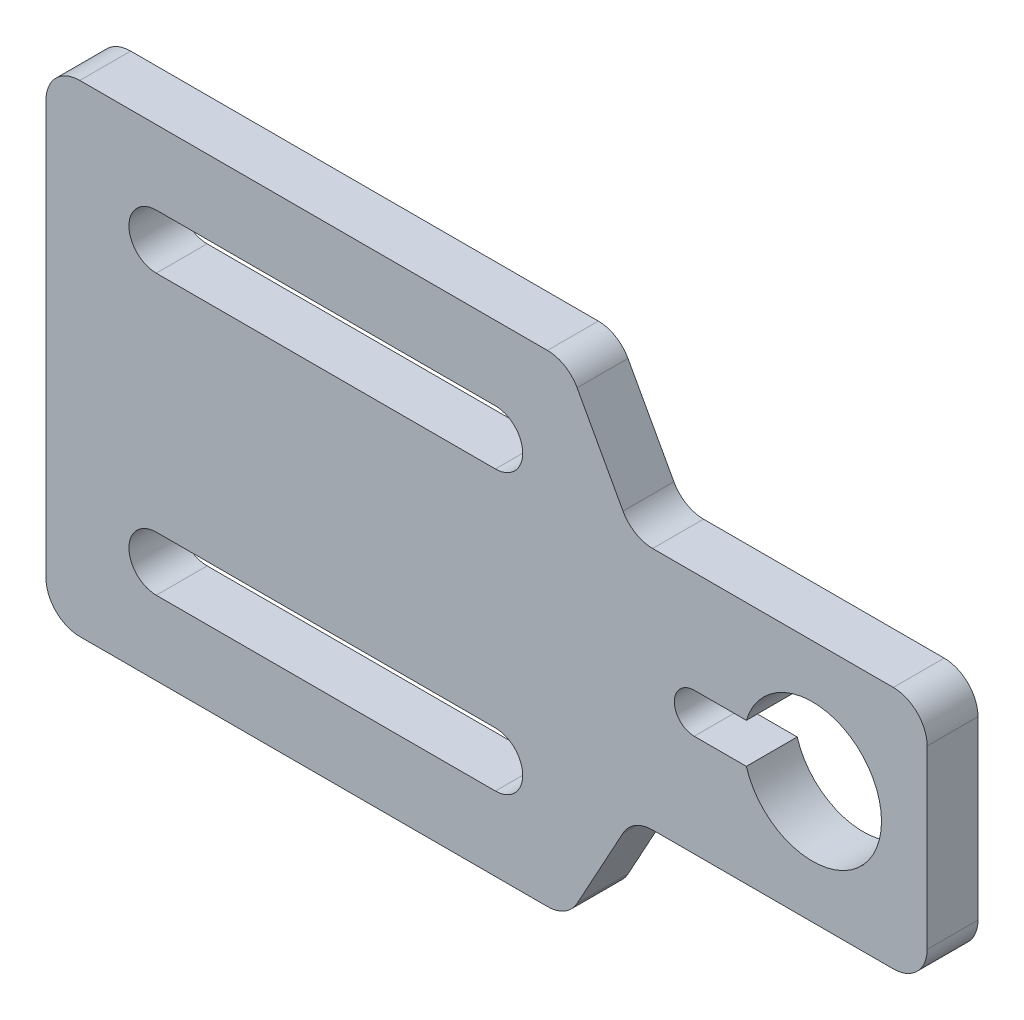
ISO-10303-21;
HEADER;
FILE_DESCRIPTION(('STEP AP214'),'2;1');
FILE_NAME('part.step','',(''),(''),'','','');
FILE_SCHEMA(('AUTOMOTIVE_DESIGN { 1 0 10303 214 1 1 1 1 }'));
ENDSEC;
DATA;
#1=APPLICATION_CONTEXT('core data for automotive mechanical design processes');
#2=APPLICATION_PROTOCOL_DEFINITION('international standard','automotive_design',2000,#1);
#3=PRODUCT_CONTEXT('',#1,'mechanical');
#4=PRODUCT('Part','Part','',(#3));
#5=PRODUCT_RELATED_PRODUCT_CATEGORY('part','',(#4));
#6=PRODUCT_DEFINITION_FORMATION('','',#4);
#7=PRODUCT_DEFINITION_CONTEXT('part definition',#1,'design');
#8=PRODUCT_DEFINITION('design','',#6,#7);
#9=PRODUCT_DEFINITION_SHAPE('','',#8);
#10=(LENGTH_UNIT() NAMED_UNIT(*) SI_UNIT(.MILLI.,.METRE.));
#11=(NAMED_UNIT(*) PLANE_ANGLE_UNIT() SI_UNIT($,.RADIAN.));
#12=(NAMED_UNIT(*) SI_UNIT($,.STERADIAN.) SOLID_ANGLE_UNIT());
#13=UNCERTAINTY_MEASURE_WITH_UNIT(LENGTH_MEASURE(1.E-05),#10,'distance_accuracy_value','');
#14=(GEOMETRIC_REPRESENTATION_CONTEXT(3) GLOBAL_UNCERTAINTY_ASSIGNED_CONTEXT((#13)) GLOBAL_UNIT_ASSIGNED_CONTEXT((#10,
#11,#12)) REPRESENTATION_CONTEXT('',''));
#15=CARTESIAN_POINT('',(0.,0.,0.));
#16=DIRECTION('',(0.,0.,1.));
#17=DIRECTION('',(1.,0.,0.));
#18=AXIS2_PLACEMENT_3D('',#15,#16,#17);
#19=CARTESIAN_POINT('',(79.5557959262744,30.8804110600189,4.7752));
#20=DIRECTION('',(0.,0.,1.));
#21=DIRECTION('',(1.,0.,0.));
#22=AXIS2_PLACEMENT_3D('',#19,#20,#21);
#23=PLANE('',#22);
#24=DIRECTION('',(1.,0.,0.));
#25=VECTOR('',#24,1.);
#26=CARTESIAN_POINT('',(10.3534251239116,33.1398074365675,4.7752));
#27=LINE('',#26,#25);
#28=CARTESIAN_POINT('',(10.3534251239116,33.1398074365675,4.7752));
#29=VERTEX_POINT('',#28);
#30=CARTESIAN_POINT('',(42.1929632730159,33.1398074365675,4.7752));
#31=VERTEX_POINT('',#30);
#32=EDGE_CURVE('E254',#29,#31,#27,.T.);
#33=ORIENTED_EDGE('',*,*,#32,.F.);
#34=CARTESIAN_POINT('',(10.3534251239116,35.7054121324207,4.7752));
#35=DIRECTION('',(0.,0.,1.));
#36=DIRECTION('',(1.,0.,0.));
#37=AXIS2_PLACEMENT_3D('',#34,#35,#36);
#38=CIRCLE('',#37,2.56560469585314);
#39=CARTESIAN_POINT('',(10.3534251239116,38.2710168282738,4.7752));
#40=VERTEX_POINT('',#39);
#41=EDGE_CURVE('E252',#40,#29,#38,.T.);
#42=ORIENTED_EDGE('',*,*,#41,.F.);
#43=DIRECTION('',(-1.,0.,0.));
#44=VECTOR('',#43,1.);
#45=CARTESIAN_POINT('',(10.3534251239116,38.2710168282738,4.7752));
#46=LINE('',#45,#44);
#47=CARTESIAN_POINT('',(42.1929632730159,38.2710168282738,4.7752));
#48=VERTEX_POINT('',#47);
#49=EDGE_CURVE('E260',#48,#40,#46,.T.);
#50=ORIENTED_EDGE('',*,*,#49,.F.);
#51=CARTESIAN_POINT('',(42.1929632730159,35.7054121324207,4.7752));
#52=DIRECTION('',(0.,0.,1.));
#53=DIRECTION('',(1.,0.,0.));
#54=AXIS2_PLACEMENT_3D('',#51,#52,#53);
#55=CIRCLE('',#54,2.56560469585314);
#56=EDGE_CURVE('E257',#31,#48,#55,.T.);
#57=ORIENTED_EDGE('',*,*,#56,.F.);
#58=EDGE_LOOP('',(#33,#42,#50,#57));
#59=FACE_BOUND('',#58,.T.);
#60=CARTESIAN_POINT('',(79.5557959262744,30.8804110600189,4.7752));
#61=DIRECTION('',(0.,0.,1.));
#62=DIRECTION('',(1.,0.,0.));
#63=AXIS2_PLACEMENT_3D('',#60,#61,#62);
#64=CIRCLE('',#63,3.175);
#65=CARTESIAN_POINT('',(82.7307959262744,30.8804110600189,4.7752));
#66=VERTEX_POINT('',#65);
#67=CARTESIAN_POINT('',(79.5557959262744,34.0554110600189,4.7752));
#68=VERTEX_POINT('',#67);
#69=EDGE_CURVE('E314',#66,#68,#64,.T.);
#70=ORIENTED_EDGE('',*,*,#69,.T.);
#71=DIRECTION('',(-1.,0.,0.));
#72=VECTOR('',#71,1.);
#73=CARTESIAN_POINT('',(56.9597878120637,34.0554110600189,4.7752));
#74=LINE('',#73,#72);
#75=CARTESIAN_POINT('',(56.9597878120637,34.0554110600189,4.7752));
#76=VERTEX_POINT('',#75);
#77=EDGE_CURVE('E317',#68,#76,#74,.T.);
#78=ORIENTED_EDGE('',*,*,#77,.T.);
#79=CARTESIAN_POINT('',(56.9597878120637,37.2304110600189,4.7752));
#80=DIRECTION('',(0.,0.,-1.));
#81=DIRECTION('',(1.,0.,0.));
#82=AXIS2_PLACEMENT_3D('',#79,#80,#81);
#83=CIRCLE('',#82,3.175);
#84=CARTESIAN_POINT('',(54.1750071616669,35.7054121324207,4.7752));
#85=VERTEX_POINT('',#84);
#86=EDGE_CURVE('E320',#76,#85,#83,.T.);
#87=ORIENTED_EDGE('',*,*,#86,.T.);
#88=DIRECTION('',(-0.480314622865584,0.877096267841502,0.));
#89=VECTOR('',#88,1.);
#90=CARTESIAN_POINT('',(49.8667571046751,43.5726513669275,4.7752));
#91=LINE('',#90,#89);
#92=CARTESIAN_POINT('',(49.8667571046751,43.5726513669275,4.7752));
#93=VERTEX_POINT('',#92);
#94=EDGE_CURVE('E322',#85,#93,#91,.T.);
#95=ORIENTED_EDGE('',*,*,#94,.T.);
#96=CARTESIAN_POINT('',(47.0819764542783,42.0476524393292,4.7752));
#97=DIRECTION('',(0.,0.,1.));
#98=DIRECTION('',(-1.,0.,0.));
#99=AXIS2_PLACEMENT_3D('',#96,#97,#98);
#100=CIRCLE('',#99,3.175);
#101=CARTESIAN_POINT('',(47.0819764542783,45.2226524393293,4.7752));
#102=VERTEX_POINT('',#101);
#103=EDGE_CURVE('E324',#93,#102,#100,.T.);
#104=ORIENTED_EDGE('',*,*,#103,.T.);
#105=DIRECTION('',(-1.,0.,0.));
#106=VECTOR('',#105,1.);
#107=CARTESIAN_POINT('',(3.17500000000002,45.2226524393293,4.7752));
#108=LINE('',#107,#106);
#109=CARTESIAN_POINT('',(3.17500000000002,45.2226524393293,4.7752));
#110=VERTEX_POINT('',#109);
#111=EDGE_CURVE('E326',#102,#110,#108,.T.);
#112=ORIENTED_EDGE('',*,*,#111,.T.);
#113=CARTESIAN_POINT('',(3.175,42.0476524393292,4.7752));
#114=DIRECTION('',(0.,0.,1.));
#115=DIRECTION('',(1.,0.,0.));
#116=AXIS2_PLACEMENT_3D('',#113,#114,#115);
#117=CIRCLE('',#116,3.175);
#118=CARTESIAN_POINT('',(0.,42.0476524393292,4.7752));
#119=VERTEX_POINT('',#118);
#120=EDGE_CURVE('E328',#110,#119,#117,.T.);
#121=ORIENTED_EDGE('',*,*,#120,.T.);
#122=DIRECTION('',(0.,-1.,0.));
#123=VECTOR('',#122,1.);
#124=CARTESIAN_POINT('',(0.,42.0476524393292,4.7752));
#125=LINE('',#124,#123);
#126=CARTESIAN_POINT('',(0.,3.17500000000002,4.7752));
#127=VERTEX_POINT('',#126);
#128=EDGE_CURVE('E330',#119,#127,#125,.T.);
#129=ORIENTED_EDGE('',*,*,#128,.T.);
#130=CARTESIAN_POINT('',(3.175,3.175,4.7752));
#131=DIRECTION('',(0.,0.,1.));
#132=DIRECTION('',(-1.,0.,0.));
#133=AXIS2_PLACEMENT_3D('',#130,#131,#132);
#134=CIRCLE('',#133,3.175);
#135=CARTESIAN_POINT('',(3.17500000000002,0.,4.7752));
#136=VERTEX_POINT('',#135);
#137=EDGE_CURVE('E332',#127,#136,#134,.T.);
#138=ORIENTED_EDGE('',*,*,#137,.T.);
#139=DIRECTION('',(1.,0.,0.));
#140=VECTOR('',#139,1.);
#141=CARTESIAN_POINT('',(3.17500000000002,0.,4.7752));
#142=LINE('',#141,#140);
#143=CARTESIAN_POINT('',(47.0819764542783,0.,4.7752));
#144=VERTEX_POINT('',#143);
#145=EDGE_CURVE('E334',#136,#144,#142,.T.);
#146=ORIENTED_EDGE('',*,*,#145,.T.);
#147=CARTESIAN_POINT('',(47.0819764542783,3.175,4.7752));
#148=DIRECTION('',(0.,0.,1.));
#149=DIRECTION('',(-1.,0.,0.));
#150=AXIS2_PLACEMENT_3D('',#147,#148,#149);
#151=CIRCLE('',#150,3.175);
#152=CARTESIAN_POINT('',(49.8667571046751,1.65000107240178,4.7752));
#153=VERTEX_POINT('',#152);
#154=EDGE_CURVE('E336',#144,#153,#151,.T.);
#155=ORIENTED_EDGE('',*,*,#154,.T.);
#156=DIRECTION('',(0.480314622865584,0.877096267841502,0.));
#157=VECTOR('',#156,1.);
#158=CARTESIAN_POINT('',(49.8667571046751,1.65000107240178,4.7752));
#159=LINE('',#158,#157);
#160=CARTESIAN_POINT('',(54.1750071616669,9.51724030690857,4.7752));
#161=VERTEX_POINT('',#160);
#162=EDGE_CURVE('E338',#153,#161,#159,.T.);
#163=ORIENTED_EDGE('',*,*,#162,.T.);
#164=CARTESIAN_POINT('',(56.9597878120637,7.99224137931035,4.7752));
#165=DIRECTION('',(0.,0.,-1.));
#166=DIRECTION('',(-1.,0.,0.));
#167=AXIS2_PLACEMENT_3D('',#164,#165,#166);
#168=CIRCLE('',#167,3.175);
#169=CARTESIAN_POINT('',(56.9597878120637,11.1672413793104,4.7752));
#170=VERTEX_POINT('',#169);
#171=EDGE_CURVE('E340',#161,#170,#168,.T.);
#172=ORIENTED_EDGE('',*,*,#171,.T.);
#173=DIRECTION('',(1.,0.,0.));
#174=VECTOR('',#173,1.);
#175=CARTESIAN_POINT('',(56.9597878120637,11.1672413793104,4.7752));
#176=LINE('',#175,#174);
#177=CARTESIAN_POINT('',(79.5557959262744,11.1672413793104,4.7752));
#178=VERTEX_POINT('',#177);
#179=EDGE_CURVE('E342',#170,#178,#176,.T.);
#180=ORIENTED_EDGE('',*,*,#179,.T.);
#181=CARTESIAN_POINT('',(79.5557959262744,14.3422413793104,4.7752));
#182=DIRECTION('',(0.,0.,1.));
#183=DIRECTION('',(-1.,0.,0.));
#184=AXIS2_PLACEMENT_3D('',#181,#182,#183);
#185=CIRCLE('',#184,3.175);
#186=CARTESIAN_POINT('',(82.7307959262744,14.3422413793104,4.7752));
#187=VERTEX_POINT('',#186);
#188=EDGE_CURVE('E344',#178,#187,#185,.T.);
#189=ORIENTED_EDGE('',*,*,#188,.T.);
#190=DIRECTION('',(0.,1.,0.));
#191=VECTOR('',#190,1.);
#192=CARTESIAN_POINT('',(82.7307959262744,14.3422413793104,4.7752));
#193=LINE('',#192,#191);
#194=EDGE_CURVE('E346',#187,#66,#193,.T.);
#195=ORIENTED_EDGE('',*,*,#194,.T.);
#196=EDGE_LOOP('',(#70,#78,#87,#95,#104,#112,#121,#129,#138,#146,#155,#163,#172,#180,#189,#195));
#197=FACE_BOUND('',#196,.T.);
#198=DIRECTION('',(1.,0.,0.));
#199=VECTOR('',#198,1.);
#200=CARTESIAN_POINT('',(65.7543656407131,20.7411684025159,4.7752));
#201=LINE('',#200,#199);
#202=CARTESIAN_POINT('',(60.8657178918998,20.7411684025159,4.7752));
#203=VERTEX_POINT('',#202);
#204=CARTESIAN_POINT('',(65.7543656407131,20.7411684025159,4.7752));
#205=VERTEX_POINT('',#204);
#206=EDGE_CURVE('E285',#203,#205,#201,.T.);
#207=ORIENTED_EDGE('',*,*,#206,.F.);
#208=CARTESIAN_POINT('',(60.8657178918998,22.6113262196646,4.7752));
#209=DIRECTION('',(0.,0.,1.));
#210=DIRECTION('',(1.,0.,0.));
#211=AXIS2_PLACEMENT_3D('',#208,#209,#210);
#212=CIRCLE('',#211,1.87015781714876);
#213=CARTESIAN_POINT('',(60.8657178918998,24.4814840368134,4.7752));
#214=VERTEX_POINT('',#213);
#215=EDGE_CURVE('E283',#214,#203,#212,.T.);
#216=ORIENTED_EDGE('',*,*,#215,.F.);
#217=DIRECTION('',(-1.,0.,0.));
#218=VECTOR('',#217,1.);
#219=CARTESIAN_POINT('',(65.7543656407131,24.4814840368134,4.7752));
#220=LINE('',#219,#218);
#221=CARTESIAN_POINT('',(65.7543656407131,24.4814840368134,4.7752));
#222=VERTEX_POINT('',#221);
#223=EDGE_CURVE('E291',#222,#214,#220,.T.);
#224=ORIENTED_EDGE('',*,*,#223,.F.);
#225=CARTESIAN_POINT('',(71.9619876069824,22.6113262196646,4.7752));
#226=DIRECTION('',(0.,0.,1.));
#227=DIRECTION('',(1.,0.,0.));
#228=AXIS2_PLACEMENT_3D('',#225,#226,#227);
#229=CIRCLE('',#228,6.48321376611571);
#230=EDGE_CURVE('E288',#205,#222,#229,.T.);
#231=ORIENTED_EDGE('',*,*,#230,.F.);
#232=EDGE_LOOP('',(#207,#216,#224,#231));
#233=FACE_BOUND('',#232,.T.);
#234=DIRECTION('',(1.,0.,0.));
#235=VECTOR('',#234,1.);
#236=CARTESIAN_POINT('',(10.3534251239116,6.95163561105543,4.7752));
#237=LINE('',#236,#235);
#238=CARTESIAN_POINT('',(10.3534251239116,6.95163561105543,4.7752));
#239=VERTEX_POINT('',#238);
#240=CARTESIAN_POINT('',(42.1929632730159,6.95163561105543,4.7752));
#241=VERTEX_POINT('',#240);
#242=EDGE_CURVE('E224',#239,#241,#237,.T.);
#243=ORIENTED_EDGE('',*,*,#242,.F.);
#244=CARTESIAN_POINT('',(10.3534251239116,9.51724030690857,4.7752));
#245=DIRECTION('',(0.,0.,1.));
#246=DIRECTION('',(-1.,0.,0.));
#247=AXIS2_PLACEMENT_3D('',#244,#245,#246);
#248=CIRCLE('',#247,2.56560469585314);
#249=CARTESIAN_POINT('',(10.3534251239116,12.0828450027617,4.7752));
#250=VERTEX_POINT('',#249);
#251=EDGE_CURVE('E216',#250,#239,#248,.T.);
#252=ORIENTED_EDGE('',*,*,#251,.F.);
#253=DIRECTION('',(-1.,0.,0.));
#254=VECTOR('',#253,1.);
#255=CARTESIAN_POINT('',(10.3534251239116,12.0828450027617,4.7752));
#256=LINE('',#255,#254);
#257=CARTESIAN_POINT('',(42.1929632730159,12.0828450027617,4.7752));
#258=VERTEX_POINT('',#257);
#259=EDGE_CURVE('E238',#258,#250,#256,.T.);
#260=ORIENTED_EDGE('',*,*,#259,.F.);
#261=CARTESIAN_POINT('',(42.1929632730159,9.51724030690857,4.7752));
#262=DIRECTION('',(0.,0.,1.));
#263=DIRECTION('',(-1.,0.,0.));
#264=AXIS2_PLACEMENT_3D('',#261,#262,#263);
#265=CIRCLE('',#264,2.56560469585314);
#266=EDGE_CURVE('E236',#241,#258,#265,.T.);
#267=ORIENTED_EDGE('',*,*,#266,.F.);
#268=EDGE_LOOP('',(#243,#252,#260,#267));
#269=FACE_BOUND('',#268,.T.);
#270=ADVANCED_FACE('F31',(#59,#197,#233,#269),#23,.T.);
#271=CARTESIAN_POINT('',(79.5557959262744,30.8804110600189,0.));
#272=DIRECTION('',(0.,0.,1.));
#273=DIRECTION('',(1.,0.,0.));
#274=AXIS2_PLACEMENT_3D('',#271,#272,#273);
#275=PLANE('',#274);
#276=CARTESIAN_POINT('',(10.3534251239116,35.7054121324207,0.));
#277=DIRECTION('',(0.,0.,1.));
#278=DIRECTION('',(1.,0.,0.));
#279=AXIS2_PLACEMENT_3D('',#276,#277,#278);
#280=CIRCLE('',#279,2.56560469585314);
#281=CARTESIAN_POINT('',(10.3534251239116,38.2710168282738,0.));
#282=VERTEX_POINT('',#281);
#283=CARTESIAN_POINT('',(10.3534251239116,33.1398074365675,0.));
#284=VERTEX_POINT('',#283);
#285=EDGE_CURVE('E232',#282,#284,#280,.T.);
#286=ORIENTED_EDGE('',*,*,#285,.T.);
#287=DIRECTION('',(1.,0.,0.));
#288=VECTOR('',#287,1.);
#289=CARTESIAN_POINT('',(10.3534251239116,33.1398074365675,0.));
#290=LINE('',#289,#288);
#291=CARTESIAN_POINT('',(42.1929632730159,33.1398074365675,0.));
#292=VERTEX_POINT('',#291);
#293=EDGE_CURVE('E265',#284,#292,#290,.T.);
#294=ORIENTED_EDGE('',*,*,#293,.T.);
#295=CARTESIAN_POINT('',(42.1929632730159,35.7054121324207,0.));
#296=DIRECTION('',(0.,0.,1.));
#297=DIRECTION('',(1.,0.,0.));
#298=AXIS2_PLACEMENT_3D('',#295,#296,#297);
#299=CIRCLE('',#298,2.56560469585314);
#300=CARTESIAN_POINT('',(42.1929632730159,38.2710168282738,0.));
#301=VERTEX_POINT('',#300);
#302=EDGE_CURVE('E268',#292,#301,#299,.T.);
#303=ORIENTED_EDGE('',*,*,#302,.T.);
#304=DIRECTION('',(-1.,0.,0.));
#305=VECTOR('',#304,1.);
#306=CARTESIAN_POINT('',(10.3534251239116,38.2710168282738,0.));
#307=LINE('',#306,#305);
#308=EDGE_CURVE('E255',#301,#282,#307,.T.);
#309=ORIENTED_EDGE('',*,*,#308,.T.);
#310=EDGE_LOOP('',(#286,#294,#303,#309));
#311=FACE_BOUND('',#310,.T.);
#312=CARTESIAN_POINT('',(79.5557959262744,30.8804110600189,0.));
#313=DIRECTION('',(0.,0.,1.));
#314=DIRECTION('',(1.,0.,0.));
#315=AXIS2_PLACEMENT_3D('',#312,#313,#314);
#316=CIRCLE('',#315,3.175);
#317=CARTESIAN_POINT('',(82.7307959262744,30.8804110600189,0.));
#318=VERTEX_POINT('',#317);
#319=CARTESIAN_POINT('',(79.5557959262744,34.0554110600189,0.));
#320=VERTEX_POINT('',#319);
#321=EDGE_CURVE('E313',#318,#320,#316,.T.);
#322=ORIENTED_EDGE('',*,*,#321,.F.);
#323=DIRECTION('',(0.,1.,0.));
#324=VECTOR('',#323,1.);
#325=CARTESIAN_POINT('',(82.7307959262744,14.3422413793104,0.));
#326=LINE('',#325,#324);
#327=CARTESIAN_POINT('',(82.7307959262744,14.3422413793104,0.));
#328=VERTEX_POINT('',#327);
#329=EDGE_CURVE('E318',#328,#318,#326,.T.);
#330=ORIENTED_EDGE('',*,*,#329,.F.);
#331=CARTESIAN_POINT('',(79.5557959262744,14.3422413793104,0.));
#332=DIRECTION('',(0.,0.,1.));
#333=DIRECTION('',(-1.,0.,0.));
#334=AXIS2_PLACEMENT_3D('',#331,#332,#333);
#335=CIRCLE('',#334,3.175);
#336=CARTESIAN_POINT('',(79.5557959262744,11.1672413793104,0.));
#337=VERTEX_POINT('',#336);
#338=EDGE_CURVE('E377',#337,#328,#335,.T.);
#339=ORIENTED_EDGE('',*,*,#338,.F.);
#340=DIRECTION('',(1.,0.,0.));
#341=VECTOR('',#340,1.);
#342=CARTESIAN_POINT('',(56.9597878120637,11.1672413793104,0.));
#343=LINE('',#342,#341);
#344=CARTESIAN_POINT('',(56.9597878120637,11.1672413793104,0.));
#345=VERTEX_POINT('',#344);
#346=EDGE_CURVE('E375',#345,#337,#343,.T.);
#347=ORIENTED_EDGE('',*,*,#346,.F.);
#348=CARTESIAN_POINT('',(56.9597878120637,7.99224137931035,0.));
#349=DIRECTION('',(0.,0.,-1.));
#350=DIRECTION('',(-1.,0.,0.));
#351=AXIS2_PLACEMENT_3D('',#348,#349,#350);
#352=CIRCLE('',#351,3.175);
#353=CARTESIAN_POINT('',(54.1750071616669,9.51724030690857,0.));
#354=VERTEX_POINT('',#353);
#355=EDGE_CURVE('E373',#354,#345,#352,.T.);
#356=ORIENTED_EDGE('',*,*,#355,.F.);
#357=DIRECTION('',(0.480314622865584,0.877096267841502,0.));
#358=VECTOR('',#357,1.);
#359=CARTESIAN_POINT('',(49.8667571046751,1.65000107240178,0.));
#360=LINE('',#359,#358);
#361=CARTESIAN_POINT('',(49.8667571046751,1.65000107240178,0.));
#362=VERTEX_POINT('',#361);
#363=EDGE_CURVE('E371',#362,#354,#360,.T.);
#364=ORIENTED_EDGE('',*,*,#363,.F.);
#365=CARTESIAN_POINT('',(47.0819764542783,3.175,0.));
#366=DIRECTION('',(0.,0.,1.));
#367=DIRECTION('',(-1.,0.,0.));
#368=AXIS2_PLACEMENT_3D('',#365,#366,#367);
#369=CIRCLE('',#368,3.175);
#370=CARTESIAN_POINT('',(47.0819764542783,0.,0.));
#371=VERTEX_POINT('',#370);
#372=EDGE_CURVE('E369',#371,#362,#369,.T.);
#373=ORIENTED_EDGE('',*,*,#372,.F.);
#374=DIRECTION('',(1.,0.,0.));
#375=VECTOR('',#374,1.);
#376=CARTESIAN_POINT('',(3.17500000000002,0.,0.));
#377=LINE('',#376,#375);
#378=CARTESIAN_POINT('',(3.17500000000002,0.,0.));
#379=VERTEX_POINT('',#378);
#380=EDGE_CURVE('E367',#379,#371,#377,.T.);
#381=ORIENTED_EDGE('',*,*,#380,.F.);
#382=CARTESIAN_POINT('',(3.175,3.175,0.));
#383=DIRECTION('',(0.,0.,1.));
#384=DIRECTION('',(-1.,0.,0.));
#385=AXIS2_PLACEMENT_3D('',#382,#383,#384);
#386=CIRCLE('',#385,3.175);
#387=CARTESIAN_POINT('',(0.,3.17500000000002,0.));
#388=VERTEX_POINT('',#387);
#389=EDGE_CURVE('E365',#388,#379,#386,.T.);
#390=ORIENTED_EDGE('',*,*,#389,.F.);
#391=DIRECTION('',(0.,-1.,0.));
#392=VECTOR('',#391,1.);
#393=CARTESIAN_POINT('',(0.,42.0476524393292,0.));
#394=LINE('',#393,#392);
#395=CARTESIAN_POINT('',(0.,42.0476524393292,0.));
#396=VERTEX_POINT('',#395);
#397=EDGE_CURVE('E363',#396,#388,#394,.T.);
#398=ORIENTED_EDGE('',*,*,#397,.F.);
#399=CARTESIAN_POINT('',(3.175,42.0476524393292,0.));
#400=DIRECTION('',(0.,0.,1.));
#401=DIRECTION('',(1.,0.,0.));
#402=AXIS2_PLACEMENT_3D('',#399,#400,#401);
#403=CIRCLE('',#402,3.175);
#404=CARTESIAN_POINT('',(3.17500000000002,45.2226524393293,0.));
#405=VERTEX_POINT('',#404);
#406=EDGE_CURVE('E361',#405,#396,#403,.T.);
#407=ORIENTED_EDGE('',*,*,#406,.F.);
#408=DIRECTION('',(-1.,0.,0.));
#409=VECTOR('',#408,1.);
#410=CARTESIAN_POINT('',(3.17500000000002,45.2226524393293,0.));
#411=LINE('',#410,#409);
#412=CARTESIAN_POINT('',(47.0819764542783,45.2226524393293,0.));
#413=VERTEX_POINT('',#412);
#414=EDGE_CURVE('E359',#413,#405,#411,.T.);
#415=ORIENTED_EDGE('',*,*,#414,.F.);
#416=CARTESIAN_POINT('',(47.0819764542783,42.0476524393292,0.));
#417=DIRECTION('',(0.,0.,1.));
#418=DIRECTION('',(-1.,0.,0.));
#419=AXIS2_PLACEMENT_3D('',#416,#417,#418);
#420=CIRCLE('',#419,3.175);
#421=CARTESIAN_POINT('',(49.8667571046751,43.5726513669275,0.));
#422=VERTEX_POINT('',#421);
#423=EDGE_CURVE('E357',#422,#413,#420,.T.);
#424=ORIENTED_EDGE('',*,*,#423,.F.);
#425=DIRECTION('',(-0.480314622865584,0.877096267841502,0.));
#426=VECTOR('',#425,1.);
#427=CARTESIAN_POINT('',(49.8667571046751,43.5726513669275,0.));
#428=LINE('',#427,#426);
#429=CARTESIAN_POINT('',(54.1750071616669,35.7054121324207,0.));
#430=VERTEX_POINT('',#429);
#431=EDGE_CURVE('E355',#430,#422,#428,.T.);
#432=ORIENTED_EDGE('',*,*,#431,.F.);
#433=CARTESIAN_POINT('',(56.9597878120637,37.2304110600189,0.));
#434=DIRECTION('',(0.,0.,-1.));
#435=DIRECTION('',(1.,0.,0.));
#436=AXIS2_PLACEMENT_3D('',#433,#434,#435);
#437=CIRCLE('',#436,3.175);
#438=CARTESIAN_POINT('',(56.9597878120637,34.0554110600189,0.));
#439=VERTEX_POINT('',#438);
#440=EDGE_CURVE('E353',#439,#430,#437,.T.);
#441=ORIENTED_EDGE('',*,*,#440,.F.);
#442=DIRECTION('',(-1.,0.,0.));
#443=VECTOR('',#442,1.);
#444=CARTESIAN_POINT('',(56.9597878120637,34.0554110600189,0.));
#445=LINE('',#444,#443);
#446=EDGE_CURVE('E351',#320,#439,#445,.T.);
#447=ORIENTED_EDGE('',*,*,#446,.F.);
#448=EDGE_LOOP('',(#322,#330,#339,#347,#356,#364,#373,#381,#390,#398,#407,#415,#424,#432,#441,#447));
#449=FACE_BOUND('',#448,.T.);
#450=CARTESIAN_POINT('',(60.8657178918998,22.6113262196646,0.));
#451=DIRECTION('',(0.,0.,1.));
#452=DIRECTION('',(1.,0.,0.));
#453=AXIS2_PLACEMENT_3D('',#450,#451,#452);
#454=CIRCLE('',#453,1.87015781714876);
#455=CARTESIAN_POINT('',(60.8657178918998,24.4814840368134,0.));
#456=VERTEX_POINT('',#455);
#457=CARTESIAN_POINT('',(60.8657178918998,20.7411684025159,0.));
#458=VERTEX_POINT('',#457);
#459=EDGE_CURVE('E282',#456,#458,#454,.T.);
#460=ORIENTED_EDGE('',*,*,#459,.T.);
#461=DIRECTION('',(1.,0.,0.));
#462=VECTOR('',#461,1.);
#463=CARTESIAN_POINT('',(65.7543656407131,20.7411684025159,0.));
#464=LINE('',#463,#462);
#465=CARTESIAN_POINT('',(65.7543656407131,20.7411684025159,0.));
#466=VERTEX_POINT('',#465);
#467=EDGE_CURVE('E296',#458,#466,#464,.T.);
#468=ORIENTED_EDGE('',*,*,#467,.T.);
#469=CARTESIAN_POINT('',(71.9619876069824,22.6113262196646,0.));
#470=DIRECTION('',(0.,0.,1.));
#471=DIRECTION('',(1.,0.,0.));
#472=AXIS2_PLACEMENT_3D('',#469,#470,#471);
#473=CIRCLE('',#472,6.48321376611571);
#474=CARTESIAN_POINT('',(65.7543656407131,24.4814840368134,0.));
#475=VERTEX_POINT('',#474);
#476=EDGE_CURVE('E299',#466,#475,#473,.T.);
#477=ORIENTED_EDGE('',*,*,#476,.T.);
#478=DIRECTION('',(-1.,0.,0.));
#479=VECTOR('',#478,1.);
#480=CARTESIAN_POINT('',(65.7543656407131,24.4814840368134,0.));
#481=LINE('',#480,#479);
#482=EDGE_CURVE('E286',#475,#456,#481,.T.);
#483=ORIENTED_EDGE('',*,*,#482,.T.);
#484=EDGE_LOOP('',(#460,#468,#477,#483));
#485=FACE_BOUND('',#484,.T.);
#486=CARTESIAN_POINT('',(10.3534251239116,9.51724030690857,0.));
#487=DIRECTION('',(0.,0.,1.));
#488=DIRECTION('',(-1.,0.,0.));
#489=AXIS2_PLACEMENT_3D('',#486,#487,#488);
#490=CIRCLE('',#489,2.56560469585314);
#491=CARTESIAN_POINT('',(10.3534251239116,12.0828450027617,0.));
#492=VERTEX_POINT('',#491);
#493=CARTESIAN_POINT('',(10.3534251239116,6.95163561105543,0.));
#494=VERTEX_POINT('',#493);
#495=EDGE_CURVE('E54',#492,#494,#490,.T.);
#496=ORIENTED_EDGE('',*,*,#495,.T.);
#497=DIRECTION('',(1.,0.,0.));
#498=VECTOR('',#497,1.);
#499=CARTESIAN_POINT('',(10.3534251239116,6.95163561105543,0.));
#500=LINE('',#499,#498);
#501=CARTESIAN_POINT('',(42.1929632730159,6.95163561105543,0.));
#502=VERTEX_POINT('',#501);
#503=EDGE_CURVE('E231',#494,#502,#500,.T.);
#504=ORIENTED_EDGE('',*,*,#503,.T.);
#505=CARTESIAN_POINT('',(42.1929632730159,9.51724030690857,0.));
#506=DIRECTION('',(0.,0.,1.));
#507=DIRECTION('',(-1.,0.,0.));
#508=AXIS2_PLACEMENT_3D('',#505,#506,#507);
#509=CIRCLE('',#508,2.56560469585314);
#510=CARTESIAN_POINT('',(42.1929632730159,12.0828450027617,0.));
#511=VERTEX_POINT('',#510);
#512=EDGE_CURVE('E244',#502,#511,#509,.T.);
#513=ORIENTED_EDGE('',*,*,#512,.T.);
#514=DIRECTION('',(-1.,0.,0.));
#515=VECTOR('',#514,1.);
#516=CARTESIAN_POINT('',(10.3534251239116,12.0828450027617,0.));
#517=LINE('',#516,#515);
#518=EDGE_CURVE('E225',#511,#492,#517,.T.);
#519=ORIENTED_EDGE('',*,*,#518,.T.);
#520=EDGE_LOOP('',(#496,#504,#513,#519));
#521=FACE_BOUND('',#520,.T.);
#522=ADVANCED_FACE('F431',(#311,#449,#485,#521),#275,.F.);
#523=CARTESIAN_POINT('',(79.5557959262744,30.8804110600189,4.7752));
#524=DIRECTION('',(0.,0.,-1.));
#525=DIRECTION('',(-1.,0.,0.));
#526=AXIS2_PLACEMENT_3D('',#523,#524,#525);
#527=CYLINDRICAL_SURFACE('',#526,3.175);
#528=ORIENTED_EDGE('',*,*,#321,.T.);
#529=DIRECTION('',(0.,0.,-1.));
#530=VECTOR('',#529,1.);
#531=CARTESIAN_POINT('',(79.5557959262744,34.0554110600189,4.7752));
#532=LINE('',#531,#530);
#533=EDGE_CURVE('E11',#68,#320,#532,.T.);
#534=ORIENTED_EDGE('',*,*,#533,.F.);
#535=ORIENTED_EDGE('',*,*,#69,.F.);
#536=DIRECTION('',(0.,0.,-1.));
#537=VECTOR('',#536,1.);
#538=CARTESIAN_POINT('',(82.7307959262744,30.8804110600189,4.7752));
#539=LINE('',#538,#537);
#540=EDGE_CURVE('E348',#66,#318,#539,.T.);
#541=ORIENTED_EDGE('',*,*,#540,.T.);
#542=EDGE_LOOP('',(#528,#534,#535,#541));
#543=FACE_BOUND('',#542,.T.);
#544=ADVANCED_FACE('F33',(#543),#527,.T.);
#545=CARTESIAN_POINT('',(56.9597878120637,34.0554110600189,4.7752));
#546=DIRECTION('',(0.,-1.,0.));
#547=DIRECTION('',(0.,0.,-1.));
#548=AXIS2_PLACEMENT_3D('',#545,#546,#547);
#549=PLANE('',#548);
#550=ORIENTED_EDGE('',*,*,#446,.T.);
#551=DIRECTION('',(0.,0.,-1.));
#552=VECTOR('',#551,1.);
#553=CARTESIAN_POINT('',(56.9597878120637,34.0554110600189,4.7752));
#554=LINE('',#553,#552);
#555=EDGE_CURVE('E39',#76,#439,#554,.T.);
#556=ORIENTED_EDGE('',*,*,#555,.F.);
#557=ORIENTED_EDGE('',*,*,#77,.F.);
#558=ORIENTED_EDGE('',*,*,#533,.T.);
#559=EDGE_LOOP('',(#550,#556,#557,#558));
#560=FACE_BOUND('',#559,.T.);
#561=ADVANCED_FACE('F449',(#560),#549,.F.);
#562=CARTESIAN_POINT('',(56.9597878120637,37.2304110600189,4.7752));
#563=DIRECTION('',(0.,0.,-1.));
#564=DIRECTION('',(-1.,0.,0.));
#565=AXIS2_PLACEMENT_3D('',#562,#563,#564);
#566=CYLINDRICAL_SURFACE('',#565,3.175);
#567=ORIENTED_EDGE('',*,*,#440,.T.);
#568=DIRECTION('',(0.,0.,-1.));
#569=VECTOR('',#568,1.);
#570=CARTESIAN_POINT('',(54.1750071616669,35.7054121324207,4.7752));
#571=LINE('',#570,#569);
#572=EDGE_CURVE('E418',#85,#430,#571,.T.);
#573=ORIENTED_EDGE('',*,*,#572,.F.);
#574=ORIENTED_EDGE('',*,*,#86,.F.);
#575=ORIENTED_EDGE('',*,*,#555,.T.);
#576=EDGE_LOOP('',(#567,#573,#574,#575));
#577=FACE_BOUND('',#576,.T.);
#578=ADVANCED_FACE('F425',(#577),#566,.F.);
#579=CARTESIAN_POINT('',(49.8667571046751,43.5726513669275,4.7752));
#580=DIRECTION('',(-0.877096267841502,-0.480314622865584,0.));
#581=DIRECTION('',(0.480314622865584,-0.877096267841502,0.));
#582=AXIS2_PLACEMENT_3D('',#579,#580,#581);
#583=PLANE('',#582);
#584=ORIENTED_EDGE('',*,*,#431,.T.);
#585=DIRECTION('',(0.,0.,-1.));
#586=VECTOR('',#585,1.);
#587=CARTESIAN_POINT('',(49.8667571046751,43.5726513669275,4.7752));
#588=LINE('',#587,#586);
#589=EDGE_CURVE('E415',#93,#422,#588,.T.);
#590=ORIENTED_EDGE('',*,*,#589,.F.);
#591=ORIENTED_EDGE('',*,*,#94,.F.);
#592=ORIENTED_EDGE('',*,*,#572,.T.);
#593=EDGE_LOOP('',(#584,#590,#591,#592));
#594=FACE_BOUND('',#593,.T.);
#595=ADVANCED_FACE('F437',(#594),#583,.F.);
#596=CARTESIAN_POINT('',(47.0819764542783,42.0476524393292,4.7752));
#597=DIRECTION('',(0.,0.,-1.));
#598=DIRECTION('',(-1.,0.,0.));
#599=AXIS2_PLACEMENT_3D('',#596,#597,#598);
#600=CYLINDRICAL_SURFACE('',#599,3.175);
#601=ORIENTED_EDGE('',*,*,#423,.T.);
#602=DIRECTION('',(0.,0.,-1.));
#603=VECTOR('',#602,1.);
#604=CARTESIAN_POINT('',(47.0819764542783,45.2226524393293,4.7752));
#605=LINE('',#604,#603);
#606=EDGE_CURVE('E412',#102,#413,#605,.T.);
#607=ORIENTED_EDGE('',*,*,#606,.F.);
#608=ORIENTED_EDGE('',*,*,#103,.F.);
#609=ORIENTED_EDGE('',*,*,#589,.T.);
#610=EDGE_LOOP('',(#601,#607,#608,#609));
#611=FACE_BOUND('',#610,.T.);
#612=ADVANCED_FACE('F441',(#611),#600,.T.);
#613=CARTESIAN_POINT('',(3.17500000000002,45.2226524393293,4.7752));
#614=DIRECTION('',(0.,-1.,0.));
#615=DIRECTION('',(0.,0.,-1.));
#616=AXIS2_PLACEMENT_3D('',#613,#614,#615);
#617=PLANE('',#616);
#618=ORIENTED_EDGE('',*,*,#414,.T.);
#619=DIRECTION('',(0.,0.,-1.));
#620=VECTOR('',#619,1.);
#621=CARTESIAN_POINT('',(3.17500000000002,45.2226524393293,4.7752));
#622=LINE('',#621,#620);
#623=EDGE_CURVE('E409',#110,#405,#622,.T.);
#624=ORIENTED_EDGE('',*,*,#623,.F.);
#625=ORIENTED_EDGE('',*,*,#111,.F.);
#626=ORIENTED_EDGE('',*,*,#606,.T.);
#627=EDGE_LOOP('',(#618,#624,#625,#626));
#628=FACE_BOUND('',#627,.T.);
#629=ADVANCED_FACE('F502',(#628),#617,.F.);
#630=CARTESIAN_POINT('',(3.175,42.0476524393292,4.7752));
#631=DIRECTION('',(0.,0.,-1.));
#632=DIRECTION('',(-1.,0.,0.));
#633=AXIS2_PLACEMENT_3D('',#630,#631,#632);
#634=CYLINDRICAL_SURFACE('',#633,3.175);
#635=ORIENTED_EDGE('',*,*,#406,.T.);
#636=DIRECTION('',(0.,0.,-1.));
#637=VECTOR('',#636,1.);
#638=CARTESIAN_POINT('',(0.,42.0476524393292,4.7752));
#639=LINE('',#638,#637);
#640=EDGE_CURVE('E406',#119,#396,#639,.T.);
#641=ORIENTED_EDGE('',*,*,#640,.F.);
#642=ORIENTED_EDGE('',*,*,#120,.F.);
#643=ORIENTED_EDGE('',*,*,#623,.T.);
#644=EDGE_LOOP('',(#635,#641,#642,#643));
#645=FACE_BOUND('',#644,.T.);
#646=ADVANCED_FACE('F499',(#645),#634,.T.);
#647=CARTESIAN_POINT('',(0.,42.0476524393292,4.7752));
#648=DIRECTION('',(1.,0.,0.));
#649=DIRECTION('',(0.,0.,-1.));
#650=AXIS2_PLACEMENT_3D('',#647,#648,#649);
#651=PLANE('',#650);
#652=ORIENTED_EDGE('',*,*,#397,.T.);
#653=DIRECTION('',(0.,0.,-1.));
#654=VECTOR('',#653,1.);
#655=CARTESIAN_POINT('',(0.,3.17500000000002,4.7752));
#656=LINE('',#655,#654);
#657=EDGE_CURVE('E403',#127,#388,#656,.T.);
#658=ORIENTED_EDGE('',*,*,#657,.F.);
#659=ORIENTED_EDGE('',*,*,#128,.F.);
#660=ORIENTED_EDGE('',*,*,#640,.T.);
#661=EDGE_LOOP('',(#652,#658,#659,#660));
#662=FACE_BOUND('',#661,.T.);
#663=ADVANCED_FACE('F495',(#662),#651,.F.);
#664=CARTESIAN_POINT('',(3.175,3.175,4.7752));
#665=DIRECTION('',(0.,0.,-1.));
#666=DIRECTION('',(-1.,0.,0.));
#667=AXIS2_PLACEMENT_3D('',#664,#665,#666);
#668=CYLINDRICAL_SURFACE('',#667,3.175);
#669=ORIENTED_EDGE('',*,*,#389,.T.);
#670=DIRECTION('',(0.,0.,-1.));
#671=VECTOR('',#670,1.);
#672=CARTESIAN_POINT('',(3.17500000000002,0.,4.7752));
#673=LINE('',#672,#671);
#674=EDGE_CURVE('E400',#136,#379,#673,.T.);
#675=ORIENTED_EDGE('',*,*,#674,.F.);
#676=ORIENTED_EDGE('',*,*,#137,.F.);
#677=ORIENTED_EDGE('',*,*,#657,.T.);
#678=EDGE_LOOP('',(#669,#675,#676,#677));
#679=FACE_BOUND('',#678,.T.);
#680=ADVANCED_FACE('F491',(#679),#668,.T.);
#681=CARTESIAN_POINT('',(3.17500000000002,0.,4.7752));
#682=DIRECTION('',(0.,1.,0.));
#683=DIRECTION('',(0.,0.,1.));
#684=AXIS2_PLACEMENT_3D('',#681,#682,#683);
#685=PLANE('',#684);
#686=ORIENTED_EDGE('',*,*,#380,.T.);
#687=DIRECTION('',(0.,0.,-1.));
#688=VECTOR('',#687,1.);
#689=CARTESIAN_POINT('',(47.0819764542783,0.,4.7752));
#690=LINE('',#689,#688);
#691=EDGE_CURVE('E397',#144,#371,#690,.T.);
#692=ORIENTED_EDGE('',*,*,#691,.F.);
#693=ORIENTED_EDGE('',*,*,#145,.F.);
#694=ORIENTED_EDGE('',*,*,#674,.T.);
#695=EDGE_LOOP('',(#686,#692,#693,#694));
#696=FACE_BOUND('',#695,.T.);
#697=ADVANCED_FACE('F486',(#696),#685,.F.);
#698=CARTESIAN_POINT('',(47.0819764542783,3.175,4.7752));
#699=DIRECTION('',(0.,0.,-1.));
#700=DIRECTION('',(-1.,0.,0.));
#701=AXIS2_PLACEMENT_3D('',#698,#699,#700);
#702=CYLINDRICAL_SURFACE('',#701,3.175);
#703=ORIENTED_EDGE('',*,*,#372,.T.);
#704=DIRECTION('',(0.,0.,-1.));
#705=VECTOR('',#704,1.);
#706=CARTESIAN_POINT('',(49.8667571046751,1.65000107240178,4.7752));
#707=LINE('',#706,#705);
#708=EDGE_CURVE('E394',#153,#362,#707,.T.);
#709=ORIENTED_EDGE('',*,*,#708,.F.);
#710=ORIENTED_EDGE('',*,*,#154,.F.);
#711=ORIENTED_EDGE('',*,*,#691,.T.);
#712=EDGE_LOOP('',(#703,#709,#710,#711));
#713=FACE_BOUND('',#712,.T.);
#714=ADVANCED_FACE('F480',(#713),#702,.T.);
#715=CARTESIAN_POINT('',(49.8667571046751,1.65000107240178,4.7752));
#716=DIRECTION('',(-0.877096267841502,0.480314622865584,0.));
#717=DIRECTION('',(-0.480314622865584,-0.877096267841502,0.));
#718=AXIS2_PLACEMENT_3D('',#715,#716,#717);
#719=PLANE('',#718);
#720=ORIENTED_EDGE('',*,*,#363,.T.);
#721=DIRECTION('',(0.,0.,-1.));
#722=VECTOR('',#721,1.);
#723=CARTESIAN_POINT('',(54.1750071616669,9.51724030690857,4.7752));
#724=LINE('',#723,#722);
#725=EDGE_CURVE('E391',#161,#354,#724,.T.);
#726=ORIENTED_EDGE('',*,*,#725,.F.);
#727=ORIENTED_EDGE('',*,*,#162,.F.);
#728=ORIENTED_EDGE('',*,*,#708,.T.);
#729=EDGE_LOOP('',(#720,#726,#727,#728));
#730=FACE_BOUND('',#729,.T.);
#731=ADVANCED_FACE('F476',(#730),#719,.F.);
#732=CARTESIAN_POINT('',(56.9597878120637,7.99224137931035,4.7752));
#733=DIRECTION('',(0.,0.,-1.));
#734=DIRECTION('',(-1.,0.,0.));
#735=AXIS2_PLACEMENT_3D('',#732,#733,#734);
#736=CYLINDRICAL_SURFACE('',#735,3.175);
#737=ORIENTED_EDGE('',*,*,#355,.T.);
#738=DIRECTION('',(0.,0.,-1.));
#739=VECTOR('',#738,1.);
#740=CARTESIAN_POINT('',(56.9597878120637,11.1672413793104,4.7752));
#741=LINE('',#740,#739);
#742=EDGE_CURVE('E388',#170,#345,#741,.T.);
#743=ORIENTED_EDGE('',*,*,#742,.F.);
#744=ORIENTED_EDGE('',*,*,#171,.F.);
#745=ORIENTED_EDGE('',*,*,#725,.T.);
#746=EDGE_LOOP('',(#737,#743,#744,#745));
#747=FACE_BOUND('',#746,.T.);
#748=ADVANCED_FACE('F471',(#747),#736,.F.);
#749=CARTESIAN_POINT('',(56.9597878120637,11.1672413793104,4.7752));
#750=DIRECTION('',(0.,1.,0.));
#751=DIRECTION('',(0.,0.,1.));
#752=AXIS2_PLACEMENT_3D('',#749,#750,#751);
#753=PLANE('',#752);
#754=ORIENTED_EDGE('',*,*,#346,.T.);
#755=DIRECTION('',(0.,0.,-1.));
#756=VECTOR('',#755,1.);
#757=CARTESIAN_POINT('',(79.5557959262744,11.1672413793104,4.7752));
#758=LINE('',#757,#756);
#759=EDGE_CURVE('E385',#178,#337,#758,.T.);
#760=ORIENTED_EDGE('',*,*,#759,.F.);
#761=ORIENTED_EDGE('',*,*,#179,.F.);
#762=ORIENTED_EDGE('',*,*,#742,.T.);
#763=EDGE_LOOP('',(#754,#760,#761,#762));
#764=FACE_BOUND('',#763,.T.);
#765=ADVANCED_FACE('F465',(#764),#753,.F.);
#766=CARTESIAN_POINT('',(79.5557959262744,14.3422413793104,4.7752));
#767=DIRECTION('',(0.,0.,-1.));
#768=DIRECTION('',(-1.,0.,0.));
#769=AXIS2_PLACEMENT_3D('',#766,#767,#768);
#770=CYLINDRICAL_SURFACE('',#769,3.175);
#771=ORIENTED_EDGE('',*,*,#338,.T.);
#772=DIRECTION('',(0.,0.,-1.));
#773=VECTOR('',#772,1.);
#774=CARTESIAN_POINT('',(82.7307959262744,14.3422413793104,4.7752));
#775=LINE('',#774,#773);
#776=EDGE_CURVE('E382',#187,#328,#775,.T.);
#777=ORIENTED_EDGE('',*,*,#776,.F.);
#778=ORIENTED_EDGE('',*,*,#188,.F.);
#779=ORIENTED_EDGE('',*,*,#759,.T.);
#780=EDGE_LOOP('',(#771,#777,#778,#779));
#781=FACE_BOUND('',#780,.T.);
#782=ADVANCED_FACE('F461',(#781),#770,.T.);
#783=CARTESIAN_POINT('',(82.7307959262744,14.3422413793104,4.7752));
#784=DIRECTION('',(-1.,0.,0.));
#785=DIRECTION('',(0.,0.,1.));
#786=AXIS2_PLACEMENT_3D('',#783,#784,#785);
#787=PLANE('',#786);
#788=ORIENTED_EDGE('',*,*,#329,.T.);
#789=ORIENTED_EDGE('',*,*,#540,.F.);
#790=ORIENTED_EDGE('',*,*,#194,.F.);
#791=ORIENTED_EDGE('',*,*,#776,.T.);
#792=EDGE_LOOP('',(#788,#789,#790,#791));
#793=FACE_BOUND('',#792,.T.);
#794=ADVANCED_FACE('F456',(#793),#787,.F.);
#795=CARTESIAN_POINT('',(60.8657178918998,22.6113262196646,4.7752));
#796=DIRECTION('',(0.,0.,-1.));
#797=DIRECTION('',(-1.,0.,0.));
#798=AXIS2_PLACEMENT_3D('',#795,#796,#797);
#799=CYLINDRICAL_SURFACE('',#798,1.87015781714876);
#800=ORIENTED_EDGE('',*,*,#459,.F.);
#801=DIRECTION('',(0.,0.,-1.));
#802=VECTOR('',#801,1.);
#803=CARTESIAN_POINT('',(60.8657178918998,24.4814840368134,4.7752));
#804=LINE('',#803,#802);
#805=EDGE_CURVE('E293',#214,#456,#804,.T.);
#806=ORIENTED_EDGE('',*,*,#805,.F.);
#807=ORIENTED_EDGE('',*,*,#215,.T.);
#808=DIRECTION('',(0.,0.,-1.));
#809=VECTOR('',#808,1.);
#810=CARTESIAN_POINT('',(60.8657178918998,20.7411684025159,4.7752));
#811=LINE('',#810,#809);
#812=EDGE_CURVE('E310',#203,#458,#811,.T.);
#813=ORIENTED_EDGE('',*,*,#812,.T.);
#814=EDGE_LOOP('',(#800,#806,#807,#813));
#815=FACE_BOUND('',#814,.T.);
#816=ADVANCED_FACE('F521',(#815),#799,.F.);
#817=CARTESIAN_POINT('',(65.7543656407131,20.7411684025159,4.7752));
#818=DIRECTION('',(0.,1.,0.));
#819=DIRECTION('',(0.,0.,1.));
#820=AXIS2_PLACEMENT_3D('',#817,#818,#819);
#821=PLANE('',#820);
#822=ORIENTED_EDGE('',*,*,#467,.F.);
#823=ORIENTED_EDGE('',*,*,#812,.F.);
#824=ORIENTED_EDGE('',*,*,#206,.T.);
#825=DIRECTION('',(0.,0.,-1.));
#826=VECTOR('',#825,1.);
#827=CARTESIAN_POINT('',(65.7543656407131,20.7411684025159,4.7752));
#828=LINE('',#827,#826);
#829=EDGE_CURVE('E308',#205,#466,#828,.T.);
#830=ORIENTED_EDGE('',*,*,#829,.T.);
#831=EDGE_LOOP('',(#822,#823,#824,#830));
#832=FACE_BOUND('',#831,.T.);
#833=ADVANCED_FACE('F583',(#832),#821,.T.);
#834=CARTESIAN_POINT('',(71.9619876069824,22.6113262196646,4.7752));
#835=DIRECTION('',(0.,0.,-1.));
#836=DIRECTION('',(-1.,0.,0.));
#837=AXIS2_PLACEMENT_3D('',#834,#835,#836);
#838=CYLINDRICAL_SURFACE('',#837,6.48321376611571);
#839=ORIENTED_EDGE('',*,*,#476,.F.);
#840=ORIENTED_EDGE('',*,*,#829,.F.);
#841=ORIENTED_EDGE('',*,*,#230,.T.);
#842=DIRECTION('',(0.,0.,-1.));
#843=VECTOR('',#842,1.);
#844=CARTESIAN_POINT('',(65.7543656407131,24.4814840368134,4.7752));
#845=LINE('',#844,#843);
#846=EDGE_CURVE('E306',#222,#475,#845,.T.);
#847=ORIENTED_EDGE('',*,*,#846,.T.);
#848=EDGE_LOOP('',(#839,#840,#841,#847));
#849=FACE_BOUND('',#848,.T.);
#850=ADVANCED_FACE('F590',(#849),#838,.F.);
#851=CARTESIAN_POINT('',(65.7543656407131,24.4814840368134,4.7752));
#852=DIRECTION('',(0.,-1.,0.));
#853=DIRECTION('',(0.,0.,-1.));
#854=AXIS2_PLACEMENT_3D('',#851,#852,#853);
#855=PLANE('',#854);
#856=ORIENTED_EDGE('',*,*,#482,.F.);
#857=ORIENTED_EDGE('',*,*,#846,.F.);
#858=ORIENTED_EDGE('',*,*,#223,.T.);
#859=ORIENTED_EDGE('',*,*,#805,.T.);
#860=EDGE_LOOP('',(#856,#857,#858,#859));
#861=FACE_BOUND('',#860,.T.);
#862=ADVANCED_FACE('F597',(#861),#855,.T.);
#863=CARTESIAN_POINT('',(10.3534251239116,35.7054121324207,4.7752));
#864=DIRECTION('',(0.,0.,-1.));
#865=DIRECTION('',(-1.,0.,0.));
#866=AXIS2_PLACEMENT_3D('',#863,#864,#865);
#867=CYLINDRICAL_SURFACE('',#866,2.56560469585314);
#868=ORIENTED_EDGE('',*,*,#285,.F.);
#869=DIRECTION('',(0.,0.,-1.));
#870=VECTOR('',#869,1.);
#871=CARTESIAN_POINT('',(10.3534251239116,38.2710168282738,4.7752));
#872=LINE('',#871,#870);
#873=EDGE_CURVE('E262',#40,#282,#872,.T.);
#874=ORIENTED_EDGE('',*,*,#873,.F.);
#875=ORIENTED_EDGE('',*,*,#41,.T.);
#876=DIRECTION('',(0.,0.,-1.));
#877=VECTOR('',#876,1.);
#878=CARTESIAN_POINT('',(10.3534251239116,33.1398074365675,4.7752));
#879=LINE('',#878,#877);
#880=EDGE_CURVE('E279',#29,#284,#879,.T.);
#881=ORIENTED_EDGE('',*,*,#880,.T.);
#882=EDGE_LOOP('',(#868,#874,#875,#881));
#883=FACE_BOUND('',#882,.T.);
#884=ADVANCED_FACE('F605',(#883),#867,.F.);
#885=CARTESIAN_POINT('',(10.3534251239116,33.1398074365675,4.7752));
#886=DIRECTION('',(0.,1.,0.));
#887=DIRECTION('',(0.,0.,1.));
#888=AXIS2_PLACEMENT_3D('',#885,#886,#887);
#889=PLANE('',#888);
#890=ORIENTED_EDGE('',*,*,#293,.F.);
#891=ORIENTED_EDGE('',*,*,#880,.F.);
#892=ORIENTED_EDGE('',*,*,#32,.T.);
#893=DIRECTION('',(0.,0.,-1.));
#894=VECTOR('',#893,1.);
#895=CARTESIAN_POINT('',(42.1929632730159,33.1398074365675,4.7752));
#896=LINE('',#895,#894);
#897=EDGE_CURVE('E277',#31,#292,#896,.T.);
#898=ORIENTED_EDGE('',*,*,#897,.T.);
#899=EDGE_LOOP('',(#890,#891,#892,#898));
#900=FACE_BOUND('',#899,.T.);
#901=ADVANCED_FACE('F613',(#900),#889,.T.);
#902=CARTESIAN_POINT('',(42.1929632730159,35.7054121324207,4.7752));
#903=DIRECTION('',(0.,0.,-1.));
#904=DIRECTION('',(-1.,0.,0.));
#905=AXIS2_PLACEMENT_3D('',#902,#903,#904);
#906=CYLINDRICAL_SURFACE('',#905,2.56560469585314);
#907=ORIENTED_EDGE('',*,*,#302,.F.);
#908=ORIENTED_EDGE('',*,*,#897,.F.);
#909=ORIENTED_EDGE('',*,*,#56,.T.);
#910=DIRECTION('',(0.,0.,-1.));
#911=VECTOR('',#910,1.);
#912=CARTESIAN_POINT('',(42.1929632730159,38.2710168282738,4.7752));
#913=LINE('',#912,#911);
#914=EDGE_CURVE('E275',#48,#301,#913,.T.);
#915=ORIENTED_EDGE('',*,*,#914,.T.);
#916=EDGE_LOOP('',(#907,#908,#909,#915));
#917=FACE_BOUND('',#916,.T.);
#918=ADVANCED_FACE('F621',(#917),#906,.F.);
#919=CARTESIAN_POINT('',(10.3534251239116,38.2710168282738,4.7752));
#920=DIRECTION('',(0.,-1.,0.));
#921=DIRECTION('',(0.,0.,-1.));
#922=AXIS2_PLACEMENT_3D('',#919,#920,#921);
#923=PLANE('',#922);
#924=ORIENTED_EDGE('',*,*,#308,.F.);
#925=ORIENTED_EDGE('',*,*,#914,.F.);
#926=ORIENTED_EDGE('',*,*,#49,.T.);
#927=ORIENTED_EDGE('',*,*,#873,.T.);
#928=EDGE_LOOP('',(#924,#925,#926,#927));
#929=FACE_BOUND('',#928,.T.);
#930=ADVANCED_FACE('F629',(#929),#923,.T.);
#931=CARTESIAN_POINT('',(10.3534251239116,9.51724030690857,4.7752));
#932=DIRECTION('',(0.,0.,-1.));
#933=DIRECTION('',(-1.,0.,0.));
#934=AXIS2_PLACEMENT_3D('',#931,#932,#933);
#935=CYLINDRICAL_SURFACE('',#934,2.56560469585314);
#936=ORIENTED_EDGE('',*,*,#495,.F.);
#937=DIRECTION('',(0.,0.,-1.));
#938=VECTOR('',#937,1.);
#939=CARTESIAN_POINT('',(10.3534251239116,12.0828450027617,4.7752));
#940=LINE('',#939,#938);
#941=EDGE_CURVE('E220',#250,#492,#940,.T.);
#942=ORIENTED_EDGE('',*,*,#941,.F.);
#943=ORIENTED_EDGE('',*,*,#251,.T.);
#944=DIRECTION('',(0.,0.,-1.));
#945=VECTOR('',#944,1.);
#946=CARTESIAN_POINT('',(10.3534251239116,6.95163561105543,4.7752));
#947=LINE('',#946,#945);
#948=EDGE_CURVE('E219',#239,#494,#947,.T.);
#949=ORIENTED_EDGE('',*,*,#948,.T.);
#950=EDGE_LOOP('',(#936,#942,#943,#949));
#951=FACE_BOUND('',#950,.T.);
#952=ADVANCED_FACE('F218',(#951),#935,.F.);
#953=CARTESIAN_POINT('',(10.3534251239116,6.95163561105543,4.7752));
#954=DIRECTION('',(0.,1.,0.));
#955=DIRECTION('',(0.,0.,1.));
#956=AXIS2_PLACEMENT_3D('',#953,#954,#955);
#957=PLANE('',#956);
#958=ORIENTED_EDGE('',*,*,#503,.F.);
#959=ORIENTED_EDGE('',*,*,#948,.F.);
#960=ORIENTED_EDGE('',*,*,#242,.T.);
#961=DIRECTION('',(0.,0.,-1.));
#962=VECTOR('',#961,1.);
#963=CARTESIAN_POINT('',(42.1929632730159,6.95163561105543,4.7752));
#964=LINE('',#963,#962);
#965=EDGE_CURVE('E233',#241,#502,#964,.T.);
#966=ORIENTED_EDGE('',*,*,#965,.T.);
#967=EDGE_LOOP('',(#958,#959,#960,#966));
#968=FACE_BOUND('',#967,.T.);
#969=ADVANCED_FACE('F228',(#968),#957,.T.);
#970=CARTESIAN_POINT('',(42.1929632730159,9.51724030690857,4.7752));
#971=DIRECTION('',(0.,0.,-1.));
#972=DIRECTION('',(-1.,0.,0.));
#973=AXIS2_PLACEMENT_3D('',#970,#971,#972);
#974=CYLINDRICAL_SURFACE('',#973,2.56560469585314);
#975=ORIENTED_EDGE('',*,*,#512,.F.);
#976=ORIENTED_EDGE('',*,*,#965,.F.);
#977=ORIENTED_EDGE('',*,*,#266,.T.);
#978=DIRECTION('',(0.,0.,-1.));
#979=VECTOR('',#978,1.);
#980=CARTESIAN_POINT('',(42.1929632730159,12.0828450027617,4.7752));
#981=LINE('',#980,#979);
#982=EDGE_CURVE('E46',#258,#511,#981,.T.);
#983=ORIENTED_EDGE('',*,*,#982,.T.);
#984=EDGE_LOOP('',(#975,#976,#977,#983));
#985=FACE_BOUND('',#984,.T.);
#986=ADVANCED_FACE('F650',(#985),#974,.F.);
#987=CARTESIAN_POINT('',(10.3534251239116,12.0828450027617,4.7752));
#988=DIRECTION('',(0.,-1.,0.));
#989=DIRECTION('',(0.,0.,-1.));
#990=AXIS2_PLACEMENT_3D('',#987,#988,#989);
#991=PLANE('',#990);
#992=ORIENTED_EDGE('',*,*,#518,.F.);
#993=ORIENTED_EDGE('',*,*,#982,.F.);
#994=ORIENTED_EDGE('',*,*,#259,.T.);
#995=ORIENTED_EDGE('',*,*,#941,.T.);
#996=EDGE_LOOP('',(#992,#993,#994,#995));
#997=FACE_BOUND('',#996,.T.);
#998=ADVANCED_FACE('F657',(#997),#991,.T.);
#999=CLOSED_SHELL('',(#270,#522,#544,#561,#578,#595,#612,#629,#646,#663,#680,#697,#714,#731,
#748,#765,#782,#794,#816,#833,#850,#862,#884,#901,#918,#930,#952,#969,#986,#998));
#1000=MANIFOLD_SOLID_BREP('B2',#999);
#1001=ADVANCED_BREP_SHAPE_REPRESENTATION('',(#18,#1000),#14);
#1002=SHAPE_DEFINITION_REPRESENTATION(#9,#1001);
ENDSEC;
END-ISO-10303-21;
